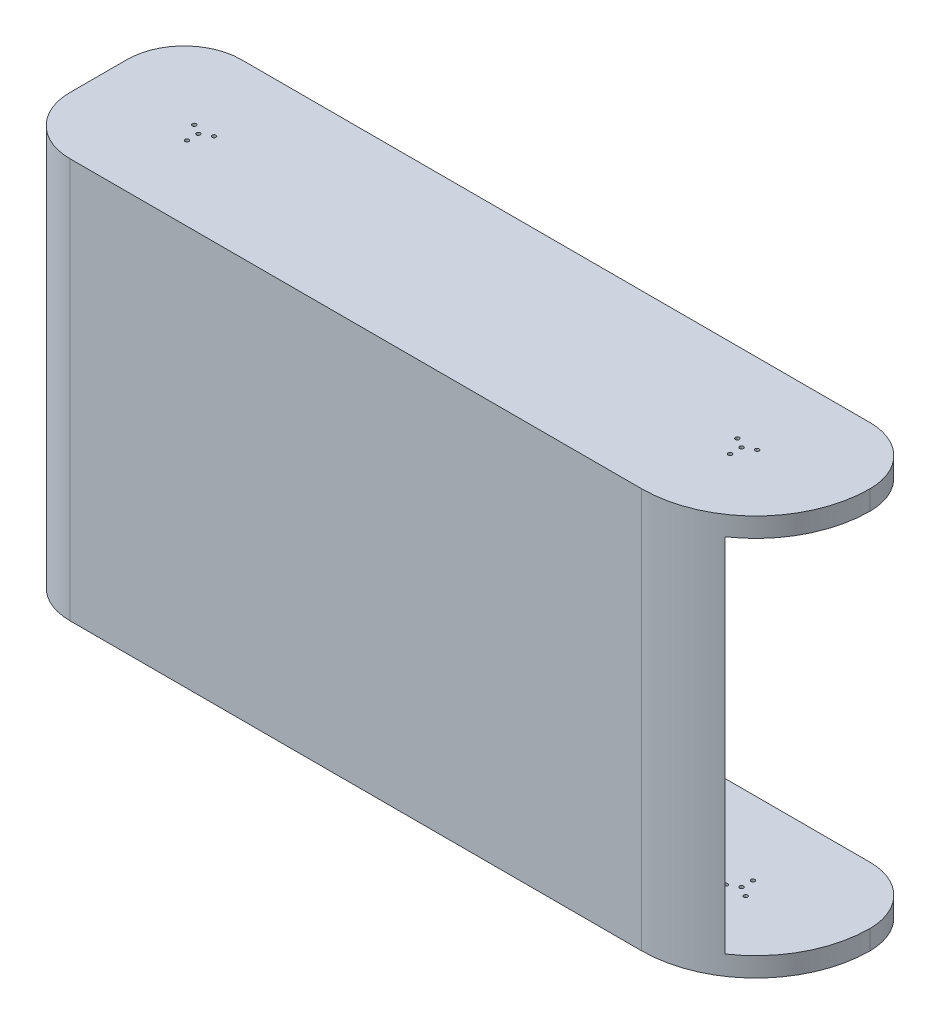
ISO-10303-21;
HEADER;
FILE_DESCRIPTION(('STEP AP214'),'2;1');
FILE_NAME('part.step','',(''),(''),'','','');
FILE_SCHEMA(('AUTOMOTIVE_DESIGN { 1 0 10303 214 1 1 1 1 }'));
ENDSEC;
DATA;
#1=APPLICATION_CONTEXT('core data for automotive mechanical design processes');
#2=APPLICATION_PROTOCOL_DEFINITION('international standard','automotive_design',2000,#1);
#3=PRODUCT_CONTEXT('',#1,'mechanical');
#4=PRODUCT('Part','Part','',(#3));
#5=PRODUCT_RELATED_PRODUCT_CATEGORY('part','',(#4));
#6=PRODUCT_DEFINITION_FORMATION('','',#4);
#7=PRODUCT_DEFINITION_CONTEXT('part definition',#1,'design');
#8=PRODUCT_DEFINITION('design','',#6,#7);
#9=PRODUCT_DEFINITION_SHAPE('','',#8);
#10=(LENGTH_UNIT() NAMED_UNIT(*) SI_UNIT(.MILLI.,.METRE.));
#11=(NAMED_UNIT(*) PLANE_ANGLE_UNIT() SI_UNIT($,.RADIAN.));
#12=(NAMED_UNIT(*) SI_UNIT($,.STERADIAN.) SOLID_ANGLE_UNIT());
#13=UNCERTAINTY_MEASURE_WITH_UNIT(LENGTH_MEASURE(1.E-05),#10,'distance_accuracy_value','');
#14=(GEOMETRIC_REPRESENTATION_CONTEXT(3) GLOBAL_UNCERTAINTY_ASSIGNED_CONTEXT((#13)) GLOBAL_UNIT_ASSIGNED_CONTEXT((#10,
#11,#12)) REPRESENTATION_CONTEXT('',''));
#15=CARTESIAN_POINT('',(0.,0.,0.));
#16=DIRECTION('',(0.,0.,1.));
#17=DIRECTION('',(1.,0.,0.));
#18=AXIS2_PLACEMENT_3D('',#15,#16,#17);
#19=CARTESIAN_POINT('',(760.000000000001,34.0119444174939,115.831345179178));
#20=DIRECTION('',(0.,-1.,0.));
#21=DIRECTION('',(0.,0.,-1.));
#22=AXIS2_PLACEMENT_3D('',#19,#20,#21);
#23=PLANE('',#22);
#24=CARTESIAN_POINT('',(475.,34.0119444174939,0.));
#25=DIRECTION('',(0.,-1.,0.));
#26=DIRECTION('',(0.,0.,-1.));
#27=AXIS2_PLACEMENT_3D('',#24,#25,#26);
#28=CIRCLE('',#27,3.40000000000003);
#29=CARTESIAN_POINT('',(475.,34.0119444174939,-3.40000000000001));
#30=VERTEX_POINT('',#29);
#31=EDGE_CURVE('E256',#30,#30,#28,.F.);
#32=ORIENTED_EDGE('',*,*,#31,.F.);
#33=EDGE_LOOP('',(#32));
#34=FACE_BOUND('',#33,.T.);
#35=CARTESIAN_POINT('',(-492.320508075689,34.0119444174939,9.99999999999999));
#36=DIRECTION('',(0.,-1.,0.));
#37=DIRECTION('',(0.,0.,-1.));
#38=AXIS2_PLACEMENT_3D('',#35,#36,#37);
#39=CIRCLE('',#38,3.40000000000003);
#40=CARTESIAN_POINT('',(-492.320508075689,34.0119444174939,6.59999999999996));
#41=VERTEX_POINT('',#40);
#42=EDGE_CURVE('E250',#41,#41,#39,.F.);
#43=ORIENTED_EDGE('',*,*,#42,.F.);
#44=EDGE_LOOP('',(#43));
#45=FACE_BOUND('',#44,.T.);
#46=CARTESIAN_POINT('',(-475.,34.0119444174939,-1.16341445918999E-13));
#47=DIRECTION('',(0.,-1.,0.));
#48=DIRECTION('',(0.,0.,-1.));
#49=AXIS2_PLACEMENT_3D('',#46,#47,#48);
#50=CIRCLE('',#49,3.40000000000003);
#51=CARTESIAN_POINT('',(-475.,34.0119444174939,-3.40000000000014));
#52=VERTEX_POINT('',#51);
#53=EDGE_CURVE('E244',#52,#52,#50,.F.);
#54=ORIENTED_EDGE('',*,*,#53,.F.);
#55=EDGE_LOOP('',(#54));
#56=FACE_BOUND('',#55,.T.);
#57=CARTESIAN_POINT('',(457.679491924311,34.0119444174939,9.99999999999983));
#58=DIRECTION('',(0.,-1.,0.));
#59=DIRECTION('',(0.,0.,-1.));
#60=AXIS2_PLACEMENT_3D('',#57,#58,#59);
#61=CIRCLE('',#60,3.40000000000003);
#62=CARTESIAN_POINT('',(457.679491924311,34.0119444174939,6.5999999999998));
#63=VERTEX_POINT('',#62);
#64=EDGE_CURVE('E238',#63,#63,#61,.F.);
#65=ORIENTED_EDGE('',*,*,#64,.F.);
#66=EDGE_LOOP('',(#65));
#67=FACE_BOUND('',#66,.T.);
#68=CARTESIAN_POINT('',(492.320508075689,34.0119444174939,10.0000000000001));
#69=DIRECTION('',(0.,-1.,0.));
#70=DIRECTION('',(0.,0.,-1.));
#71=AXIS2_PLACEMENT_3D('',#68,#69,#70);
#72=CIRCLE('',#71,3.40000000000003);
#73=CARTESIAN_POINT('',(492.320508075689,34.0119444174939,6.60000000000008));
#74=VERTEX_POINT('',#73);
#75=EDGE_CURVE('E237',#74,#74,#72,.F.);
#76=ORIENTED_EDGE('',*,*,#75,.F.);
#77=EDGE_LOOP('',(#76));
#78=FACE_BOUND('',#77,.T.);
#79=CARTESIAN_POINT('',(475.,34.0119444174939,-20.));
#80=DIRECTION('',(0.,-1.,0.));
#81=DIRECTION('',(0.,0.,-1.));
#82=AXIS2_PLACEMENT_3D('',#79,#80,#81);
#83=CIRCLE('',#82,3.40000000000003);
#84=CARTESIAN_POINT('',(475.,34.0119444174939,-23.4));
#85=VERTEX_POINT('',#84);
#86=EDGE_CURVE('E241',#85,#85,#83,.F.);
#87=ORIENTED_EDGE('',*,*,#86,.F.);
#88=EDGE_LOOP('',(#87));
#89=FACE_BOUND('',#88,.T.);
#90=CARTESIAN_POINT('',(-457.679491924311,34.0119444174939,9.99999999999973));
#91=DIRECTION('',(0.,-1.,0.));
#92=DIRECTION('',(0.,0.,-1.));
#93=AXIS2_PLACEMENT_3D('',#90,#91,#92);
#94=CIRCLE('',#93,3.40000000000003);
#95=CARTESIAN_POINT('',(-457.679491924311,34.0119444174939,6.5999999999997));
#96=VERTEX_POINT('',#95);
#97=EDGE_CURVE('E247',#96,#96,#94,.F.);
#98=ORIENTED_EDGE('',*,*,#97,.F.);
#99=EDGE_LOOP('',(#98));
#100=FACE_BOUND('',#99,.T.);
#101=CARTESIAN_POINT('',(-475.,34.0119444174939,-20.0000000000001));
#102=DIRECTION('',(0.,-1.,0.));
#103=DIRECTION('',(0.,0.,-1.));
#104=AXIS2_PLACEMENT_3D('',#101,#102,#103);
#105=CIRCLE('',#104,3.40000000000003);
#106=CARTESIAN_POINT('',(-475.,34.0119444174939,-23.4000000000001));
#107=VERTEX_POINT('',#106);
#108=EDGE_CURVE('E253',#107,#107,#105,.F.);
#109=ORIENTED_EDGE('',*,*,#108,.F.);
#110=EDGE_LOOP('',(#109));
#111=FACE_BOUND('',#110,.T.);
#112=DIRECTION('',(0.,0.,-1.));
#113=VECTOR('',#112,1.);
#114=CARTESIAN_POINT('',(149.543106064845,34.0119444174939,-150.));
#115=LINE('',#114,#113);
#116=CARTESIAN_POINT('',(149.543106064845,34.0119444174939,-114.978897587595));
#117=VERTEX_POINT('',#116);
#118=CARTESIAN_POINT('',(149.543106064845,34.0119444174939,-150.));
#119=VERTEX_POINT('',#118);
#120=EDGE_CURVE('E192',#117,#119,#115,.T.);
#121=ORIENTED_EDGE('',*,*,#120,.F.);
#122=DIRECTION('',(1.,0.,0.));
#123=VECTOR('',#122,1.);
#124=CARTESIAN_POINT('',(149.543106064845,34.0119444174939,-114.978897587595));
#125=LINE('',#124,#123);
#126=CARTESIAN_POINT('',(-203.152898805073,34.0119444174939,-114.978897587595));
#127=VERTEX_POINT('',#126);
#128=EDGE_CURVE('E54',#127,#117,#125,.T.);
#129=ORIENTED_EDGE('',*,*,#128,.F.);
#130=DIRECTION('',(0.,0.,1.));
#131=VECTOR('',#130,1.);
#132=CARTESIAN_POINT('',(-203.152898805073,34.0119444174939,-150.));
#133=LINE('',#132,#131);
#134=CARTESIAN_POINT('',(-203.152898805073,34.0119444174939,-150.));
#135=VERTEX_POINT('',#134);
#136=EDGE_CURVE('E178',#135,#127,#133,.T.);
#137=ORIENTED_EDGE('',*,*,#136,.F.);
#138=DIRECTION('',(1.,0.,0.));
#139=VECTOR('',#138,1.);
#140=CARTESIAN_POINT('',(-650.,34.0119444174939,-150.));
#141=LINE('',#140,#139);
#142=CARTESIAN_POINT('',(-550.,34.0119444174939,-150.));
#143=VERTEX_POINT('',#142);
#144=EDGE_CURVE('E261',#143,#135,#141,.T.);
#145=ORIENTED_EDGE('',*,*,#144,.F.);
#146=CARTESIAN_POINT('',(-550.,34.0119444174939,-50.));
#147=DIRECTION('',(0.,-1.,0.));
#148=DIRECTION('',(0.,0.,-1.));
#149=AXIS2_PLACEMENT_3D('',#146,#147,#148);
#150=CIRCLE('',#149,100.);
#151=CARTESIAN_POINT('',(-650.,34.0119444174939,-50.));
#152=VERTEX_POINT('',#151);
#153=EDGE_CURVE('E259',#143,#152,#150,.F.);
#154=ORIENTED_EDGE('',*,*,#153,.T.);
#155=DIRECTION('',(0.,0.,1.));
#156=VECTOR('',#155,1.);
#157=CARTESIAN_POINT('',(-650.,34.0119444174939,115.831345179178));
#158=LINE('',#157,#156);
#159=CARTESIAN_POINT('',(-650.,34.0119444174939,50.));
#160=VERTEX_POINT('',#159);
#161=EDGE_CURVE('E196',#152,#160,#158,.T.);
#162=ORIENTED_EDGE('',*,*,#161,.T.);
#163=CARTESIAN_POINT('',(-550.,34.0119444174939,50.));
#164=DIRECTION('',(0.,-1.,0.));
#165=DIRECTION('',(0.,0.,-1.));
#166=AXIS2_PLACEMENT_3D('',#163,#164,#165);
#167=CIRCLE('',#166,100.);
#168=CARTESIAN_POINT('',(-625.274391341943,34.0119444174939,115.831345179178));
#169=VERTEX_POINT('',#168);
#170=EDGE_CURVE('E268',#160,#169,#167,.F.);
#171=ORIENTED_EDGE('',*,*,#170,.T.);
#172=DIRECTION('',(-1.,0.,0.));
#173=VECTOR('',#172,1.);
#174=CARTESIAN_POINT('',(760.000000000001,34.0119444174939,115.831345179178));
#175=LINE('',#174,#173);
#176=CARTESIAN_POINT('',(561.803242153635,34.0119444174939,115.831345179178));
#177=VERTEX_POINT('',#176);
#178=EDGE_CURVE('E198',#177,#169,#175,.T.);
#179=ORIENTED_EDGE('',*,*,#178,.F.);
#180=CARTESIAN_POINT('',(450.,34.0119444174939,-50.0000000000001));
#181=DIRECTION('',(0.,-1.,0.));
#182=DIRECTION('',(0.,0.,-1.));
#183=AXIS2_PLACEMENT_3D('',#180,#181,#182);
#184=CIRCLE('',#183,200.);
#185=CARTESIAN_POINT('',(650.,34.0119444174939,-50.0000000000001));
#186=VERTEX_POINT('',#185);
#187=EDGE_CURVE('E266',#177,#186,#184,.F.);
#188=ORIENTED_EDGE('',*,*,#187,.T.);
#189=CARTESIAN_POINT('',(550.,34.0119444174939,-50.0000000000001));
#190=DIRECTION('',(0.,-1.,0.));
#191=DIRECTION('',(0.,0.,-1.));
#192=AXIS2_PLACEMENT_3D('',#189,#190,#191);
#193=CIRCLE('',#192,100.);
#194=CARTESIAN_POINT('',(550.,34.0119444174939,-150.));
#195=VERTEX_POINT('',#194);
#196=EDGE_CURVE('E264',#186,#195,#193,.F.);
#197=ORIENTED_EDGE('',*,*,#196,.T.);
#198=EDGE_CURVE('E60',#119,#195,#141,.T.);
#199=ORIENTED_EDGE('',*,*,#198,.F.);
#200=EDGE_LOOP('',(#121,#129,#137,#145,#154,#162,#171,#179,#188,#197,#199));
#201=FACE_BOUND('',#200,.T.);
#202=ADVANCED_FACE('F39',(#34,#45,#56,#67,#78,#89,#100,#111,#201),#23,.F.);
#203=CARTESIAN_POINT('',(760.000000000001,665.988055582506,115.831345179178));
#204=DIRECTION('',(0.,1.,0.));
#205=DIRECTION('',(0.,0.,1.));
#206=AXIS2_PLACEMENT_3D('',#203,#204,#205);
#207=PLANE('',#206);
#208=CARTESIAN_POINT('',(-475.,665.988055582506,-1.16341445918999E-13));
#209=DIRECTION('',(0.,1.,0.));
#210=DIRECTION('',(0.,0.,1.));
#211=AXIS2_PLACEMENT_3D('',#208,#209,#210);
#212=CIRCLE('',#211,3.40000000000003);
#213=CARTESIAN_POINT('',(-475.,665.988055582506,3.39999999999991));
#214=VERTEX_POINT('',#213);
#215=EDGE_CURVE('E223',#214,#214,#212,.F.);
#216=ORIENTED_EDGE('',*,*,#215,.F.);
#217=EDGE_LOOP('',(#216));
#218=FACE_BOUND('',#217,.T.);
#219=CARTESIAN_POINT('',(-457.679491924311,665.988055582506,-10.0000000000002));
#220=DIRECTION('',(0.,1.,0.));
#221=DIRECTION('',(0.,0.,1.));
#222=AXIS2_PLACEMENT_3D('',#219,#220,#221);
#223=CIRCLE('',#222,3.40000000000003);
#224=CARTESIAN_POINT('',(-457.679491924311,665.988055582506,-6.6000000000002));
#225=VERTEX_POINT('',#224);
#226=EDGE_CURVE('E217',#225,#225,#223,.F.);
#227=ORIENTED_EDGE('',*,*,#226,.F.);
#228=EDGE_LOOP('',(#227));
#229=FACE_BOUND('',#228,.T.);
#230=CARTESIAN_POINT('',(-475.,665.988055582506,19.9999999999999));
#231=DIRECTION('',(0.,1.,0.));
#232=DIRECTION('',(0.,0.,1.));
#233=AXIS2_PLACEMENT_3D('',#230,#231,#232);
#234=CIRCLE('',#233,3.40000000000003);
#235=CARTESIAN_POINT('',(-475.,665.988055582506,23.3999999999999));
#236=VERTEX_POINT('',#235);
#237=EDGE_CURVE('E211',#236,#236,#234,.F.);
#238=ORIENTED_EDGE('',*,*,#237,.F.);
#239=EDGE_LOOP('',(#238));
#240=FACE_BOUND('',#239,.T.);
#241=CARTESIAN_POINT('',(492.320508075689,665.988055582506,-10.0000000000001));
#242=DIRECTION('',(0.,1.,0.));
#243=DIRECTION('',(0.,0.,1.));
#244=AXIS2_PLACEMENT_3D('',#241,#242,#243);
#245=CIRCLE('',#244,3.40000000000003);
#246=CARTESIAN_POINT('',(492.320508075689,665.988055582506,-6.60000000000007));
#247=VERTEX_POINT('',#246);
#248=EDGE_CURVE('E205',#247,#247,#245,.F.);
#249=ORIENTED_EDGE('',*,*,#248,.F.);
#250=EDGE_LOOP('',(#249));
#251=FACE_BOUND('',#250,.T.);
#252=CARTESIAN_POINT('',(475.,665.988055582506,20.));
#253=DIRECTION('',(0.,1.,0.));
#254=DIRECTION('',(0.,0.,1.));
#255=AXIS2_PLACEMENT_3D('',#252,#253,#254);
#256=CIRCLE('',#255,3.40000000000003);
#257=CARTESIAN_POINT('',(475.,665.988055582506,23.4));
#258=VERTEX_POINT('',#257);
#259=EDGE_CURVE('E202',#258,#258,#256,.F.);
#260=ORIENTED_EDGE('',*,*,#259,.F.);
#261=EDGE_LOOP('',(#260));
#262=FACE_BOUND('',#261,.T.);
#263=CARTESIAN_POINT('',(475.,665.988055582506,0.));
#264=DIRECTION('',(0.,1.,0.));
#265=DIRECTION('',(0.,0.,1.));
#266=AXIS2_PLACEMENT_3D('',#263,#264,#265);
#267=CIRCLE('',#266,3.40000000000003);
#268=CARTESIAN_POINT('',(475.,665.988055582506,3.40000000000004));
#269=VERTEX_POINT('',#268);
#270=EDGE_CURVE('E208',#269,#269,#267,.F.);
#271=ORIENTED_EDGE('',*,*,#270,.F.);
#272=EDGE_LOOP('',(#271));
#273=FACE_BOUND('',#272,.T.);
#274=CARTESIAN_POINT('',(457.679491924311,665.988055582506,-9.99999999999982));
#275=DIRECTION('',(0.,1.,0.));
#276=DIRECTION('',(0.,0.,1.));
#277=AXIS2_PLACEMENT_3D('',#274,#275,#276);
#278=CIRCLE('',#277,3.40000000000003);
#279=CARTESIAN_POINT('',(457.679491924311,665.988055582506,-6.59999999999979));
#280=VERTEX_POINT('',#279);
#281=EDGE_CURVE('E214',#280,#280,#278,.F.);
#282=ORIENTED_EDGE('',*,*,#281,.F.);
#283=EDGE_LOOP('',(#282));
#284=FACE_BOUND('',#283,.T.);
#285=CARTESIAN_POINT('',(-492.320508075689,665.988055582506,-9.99999999999994));
#286=DIRECTION('',(0.,1.,0.));
#287=DIRECTION('',(0.,0.,1.));
#288=AXIS2_PLACEMENT_3D('',#285,#286,#287);
#289=CIRCLE('',#288,3.40000000000003);
#290=CARTESIAN_POINT('',(-492.320508075689,665.988055582506,-6.59999999999992));
#291=VERTEX_POINT('',#290);
#292=EDGE_CURVE('E220',#291,#291,#289,.F.);
#293=ORIENTED_EDGE('',*,*,#292,.F.);
#294=EDGE_LOOP('',(#293));
#295=FACE_BOUND('',#294,.T.);
#296=DIRECTION('',(0.,0.,-1.));
#297=VECTOR('',#296,1.);
#298=CARTESIAN_POINT('',(149.543106064845,665.988055582506,-150.));
#299=LINE('',#298,#297);
#300=CARTESIAN_POINT('',(149.543106064845,665.988055582506,-114.978897587595));
#301=VERTEX_POINT('',#300);
#302=CARTESIAN_POINT('',(149.543106064845,665.988055582506,-150.));
#303=VERTEX_POINT('',#302);
#304=EDGE_CURVE('E173',#301,#303,#299,.T.);
#305=ORIENTED_EDGE('',*,*,#304,.T.);
#306=DIRECTION('',(-1.,0.,0.));
#307=VECTOR('',#306,1.);
#308=CARTESIAN_POINT('',(-650.,665.988055582506,-150.));
#309=LINE('',#308,#307);
#310=CARTESIAN_POINT('',(550.,665.988055582506,-150.));
#311=VERTEX_POINT('',#310);
#312=EDGE_CURVE('E228',#311,#303,#309,.T.);
#313=ORIENTED_EDGE('',*,*,#312,.F.);
#314=CARTESIAN_POINT('',(550.,665.988055582506,-50.0000000000001));
#315=DIRECTION('',(0.,1.,0.));
#316=DIRECTION('',(0.,0.,1.));
#317=AXIS2_PLACEMENT_3D('',#314,#315,#316);
#318=CIRCLE('',#317,100.);
#319=CARTESIAN_POINT('',(650.,665.988055582506,-50.0000000000001));
#320=VERTEX_POINT('',#319);
#321=EDGE_CURVE('E231',#311,#320,#318,.F.);
#322=ORIENTED_EDGE('',*,*,#321,.T.);
#323=CARTESIAN_POINT('',(450.,665.988055582506,-50.0000000000001));
#324=DIRECTION('',(0.,1.,0.));
#325=DIRECTION('',(0.,0.,1.));
#326=AXIS2_PLACEMENT_3D('',#323,#324,#325);
#327=CIRCLE('',#326,200.);
#328=CARTESIAN_POINT('',(561.803242153635,665.988055582506,115.831345179178));
#329=VERTEX_POINT('',#328);
#330=EDGE_CURVE('E233',#320,#329,#327,.F.);
#331=ORIENTED_EDGE('',*,*,#330,.T.);
#332=DIRECTION('',(-1.,0.,0.));
#333=VECTOR('',#332,1.);
#334=CARTESIAN_POINT('',(760.000000000001,665.988055582506,115.831345179178));
#335=LINE('',#334,#333);
#336=CARTESIAN_POINT('',(-625.274391341943,665.988055582506,115.831345179178));
#337=VERTEX_POINT('',#336);
#338=EDGE_CURVE('E199',#329,#337,#335,.T.);
#339=ORIENTED_EDGE('',*,*,#338,.T.);
#340=CARTESIAN_POINT('',(-550.,665.988055582506,50.));
#341=DIRECTION('',(0.,1.,0.));
#342=DIRECTION('',(0.,0.,1.));
#343=AXIS2_PLACEMENT_3D('',#340,#341,#342);
#344=CIRCLE('',#343,100.);
#345=CARTESIAN_POINT('',(-650.,665.988055582506,50.));
#346=VERTEX_POINT('',#345);
#347=EDGE_CURVE('E235',#337,#346,#344,.F.);
#348=ORIENTED_EDGE('',*,*,#347,.T.);
#349=DIRECTION('',(0.,0.,-1.));
#350=VECTOR('',#349,1.);
#351=CARTESIAN_POINT('',(-650.,665.988055582506,115.831345179178));
#352=LINE('',#351,#350);
#353=CARTESIAN_POINT('',(-650.,665.988055582506,-50.));
#354=VERTEX_POINT('',#353);
#355=EDGE_CURVE('E172',#346,#354,#352,.T.);
#356=ORIENTED_EDGE('',*,*,#355,.T.);
#357=CARTESIAN_POINT('',(-550.,665.988055582506,-50.));
#358=DIRECTION('',(0.,1.,0.));
#359=DIRECTION('',(0.,0.,1.));
#360=AXIS2_PLACEMENT_3D('',#357,#358,#359);
#361=CIRCLE('',#360,100.);
#362=CARTESIAN_POINT('',(-550.,665.988055582506,-150.));
#363=VERTEX_POINT('',#362);
#364=EDGE_CURVE('E226',#354,#363,#361,.F.);
#365=ORIENTED_EDGE('',*,*,#364,.T.);
#366=CARTESIAN_POINT('',(-203.152898805073,665.988055582506,-150.));
#367=VERTEX_POINT('',#366);
#368=EDGE_CURVE('E168',#367,#363,#309,.T.);
#369=ORIENTED_EDGE('',*,*,#368,.F.);
#370=DIRECTION('',(0.,0.,1.));
#371=VECTOR('',#370,1.);
#372=CARTESIAN_POINT('',(-203.152898805073,665.988055582506,-150.));
#373=LINE('',#372,#371);
#374=CARTESIAN_POINT('',(-203.152898805073,665.988055582506,-114.978897587595));
#375=VERTEX_POINT('',#374);
#376=EDGE_CURVE('E161',#367,#375,#373,.T.);
#377=ORIENTED_EDGE('',*,*,#376,.T.);
#378=DIRECTION('',(1.,0.,0.));
#379=VECTOR('',#378,1.);
#380=CARTESIAN_POINT('',(149.543106064845,665.988055582506,-114.978897587595));
#381=LINE('',#380,#379);
#382=EDGE_CURVE('E165',#375,#301,#381,.T.);
#383=ORIENTED_EDGE('',*,*,#382,.T.);
#384=EDGE_LOOP('',(#305,#313,#322,#331,#339,#348,#356,#365,#369,#377,#383));
#385=FACE_BOUND('',#384,.T.);
#386=ADVANCED_FACE('F163',(#218,#229,#240,#251,#262,#273,#284,#295,#385),#207,.F.);
#387=CARTESIAN_POINT('',(-650.,700.,-150.));
#388=DIRECTION('',(1.,0.,0.));
#389=DIRECTION('',(0.,0.,-1.));
#390=AXIS2_PLACEMENT_3D('',#387,#388,#389);
#391=PLANE('',#390);
#392=DIRECTION('',(0.,-1.,0.));
#393=VECTOR('',#392,1.);
#394=CARTESIAN_POINT('',(-650.,700.,-50.));
#395=LINE('',#394,#393);
#396=CARTESIAN_POINT('',(-650.,700.,-50.));
#397=VERTEX_POINT('',#396);
#398=EDGE_CURVE('E369',#397,#354,#395,.T.);
#399=ORIENTED_EDGE('',*,*,#398,.T.);
#400=ORIENTED_EDGE('',*,*,#355,.F.);
#401=DIRECTION('',(0.,-1.,0.));
#402=VECTOR('',#401,1.);
#403=CARTESIAN_POINT('',(-650.,700.,50.));
#404=LINE('',#403,#402);
#405=CARTESIAN_POINT('',(-650.,700.,50.));
#406=VERTEX_POINT('',#405);
#407=EDGE_CURVE('E362',#346,#406,#404,.F.);
#408=ORIENTED_EDGE('',*,*,#407,.T.);
#409=DIRECTION('',(0.,0.,1.));
#410=VECTOR('',#409,1.);
#411=CARTESIAN_POINT('',(-650.,700.,-150.));
#412=LINE('',#411,#410);
#413=EDGE_CURVE('E324',#397,#406,#412,.T.);
#414=ORIENTED_EDGE('',*,*,#413,.F.);
#415=EDGE_LOOP('',(#399,#400,#408,#414));
#416=FACE_BOUND('',#415,.T.);
#417=ADVANCED_FACE('F448',(#416),#391,.F.);
#418=CARTESIAN_POINT('',(550.,700.,-50.0000000000001));
#419=DIRECTION('',(0.,-1.,0.));
#420=DIRECTION('',(0.,0.,-1.));
#421=AXIS2_PLACEMENT_3D('',#418,#419,#420);
#422=CYLINDRICAL_SURFACE('',#421,100.);
#423=ORIENTED_EDGE('',*,*,#321,.F.);
#424=DIRECTION('',(0.,-1.,0.));
#425=VECTOR('',#424,1.);
#426=CARTESIAN_POINT('',(550.,700.,-150.));
#427=LINE('',#426,#425);
#428=CARTESIAN_POINT('',(550.,700.,-150.));
#429=VERTEX_POINT('',#428);
#430=EDGE_CURVE('E348',#429,#311,#427,.T.);
#431=ORIENTED_EDGE('',*,*,#430,.F.);
#432=CARTESIAN_POINT('',(550.,700.,-50.0000000000001));
#433=DIRECTION('',(0.,1.,0.));
#434=DIRECTION('',(0.,0.,1.));
#435=AXIS2_PLACEMENT_3D('',#432,#433,#434);
#436=CIRCLE('',#435,100.);
#437=CARTESIAN_POINT('',(650.,700.,-50.0000000000001));
#438=VERTEX_POINT('',#437);
#439=EDGE_CURVE('E354',#438,#429,#436,.T.);
#440=ORIENTED_EDGE('',*,*,#439,.F.);
#441=DIRECTION('',(0.,-1.,0.));
#442=VECTOR('',#441,1.);
#443=CARTESIAN_POINT('',(650.,700.,-50.0000000000001));
#444=LINE('',#443,#442);
#445=EDGE_CURVE('E336',#438,#320,#444,.T.);
#446=ORIENTED_EDGE('',*,*,#445,.T.);
#447=EDGE_LOOP('',(#423,#431,#440,#446));
#448=FACE_BOUND('',#447,.T.);
#449=ADVANCED_FACE('F407',(#448),#422,.T.);
#450=CARTESIAN_POINT('',(-550.,700.,-50.));
#451=DIRECTION('',(0.,-1.,0.));
#452=DIRECTION('',(0.,0.,-1.));
#453=AXIS2_PLACEMENT_3D('',#450,#451,#452);
#454=CYLINDRICAL_SURFACE('',#453,100.);
#455=ORIENTED_EDGE('',*,*,#364,.F.);
#456=ORIENTED_EDGE('',*,*,#398,.F.);
#457=CARTESIAN_POINT('',(-550.,700.,-50.));
#458=DIRECTION('',(0.,1.,0.));
#459=DIRECTION('',(0.,0.,1.));
#460=AXIS2_PLACEMENT_3D('',#457,#458,#459);
#461=CIRCLE('',#460,100.);
#462=CARTESIAN_POINT('',(-550.,700.,-150.));
#463=VERTEX_POINT('',#462);
#464=EDGE_CURVE('E47',#463,#397,#461,.T.);
#465=ORIENTED_EDGE('',*,*,#464,.F.);
#466=DIRECTION('',(0.,-1.,0.));
#467=VECTOR('',#466,1.);
#468=CARTESIAN_POINT('',(-550.,700.,-150.));
#469=LINE('',#468,#467);
#470=EDGE_CURVE('E374',#363,#463,#469,.F.);
#471=ORIENTED_EDGE('',*,*,#470,.F.);
#472=EDGE_LOOP('',(#455,#456,#465,#471));
#473=FACE_BOUND('',#472,.T.);
#474=ADVANCED_FACE('F453',(#473),#454,.T.);
#475=CARTESIAN_POINT('',(-650.,700.,-150.));
#476=DIRECTION('',(0.,0.,1.));
#477=DIRECTION('',(1.,0.,0.));
#478=AXIS2_PLACEMENT_3D('',#475,#476,#477);
#479=PLANE('',#478);
#480=CARTESIAN_POINT('',(-550.,0.,-150.));
#481=VERTEX_POINT('',#480);
#482=EDGE_CURVE('E375',#481,#143,#469,.F.);
#483=ORIENTED_EDGE('',*,*,#482,.T.);
#484=ORIENTED_EDGE('',*,*,#144,.T.);
#485=DIRECTION('',(0.,-1.,0.));
#486=VECTOR('',#485,1.);
#487=CARTESIAN_POINT('',(-203.152898805073,1020.41851345172,-150.));
#488=LINE('',#487,#486);
#489=EDGE_CURVE('E191',#367,#135,#488,.T.);
#490=ORIENTED_EDGE('',*,*,#489,.F.);
#491=ORIENTED_EDGE('',*,*,#368,.T.);
#492=ORIENTED_EDGE('',*,*,#470,.T.);
#493=DIRECTION('',(-1.,0.,0.));
#494=VECTOR('',#493,1.);
#495=CARTESIAN_POINT('',(-650.,700.,-150.));
#496=LINE('',#495,#494);
#497=EDGE_CURVE('E321',#429,#463,#496,.T.);
#498=ORIENTED_EDGE('',*,*,#497,.F.);
#499=ORIENTED_EDGE('',*,*,#430,.T.);
#500=ORIENTED_EDGE('',*,*,#312,.T.);
#501=DIRECTION('',(0.,-1.,0.));
#502=VECTOR('',#501,1.);
#503=CARTESIAN_POINT('',(149.543106064845,1020.41851345172,-150.));
#504=LINE('',#503,#502);
#505=EDGE_CURVE('E189',#303,#119,#504,.T.);
#506=ORIENTED_EDGE('',*,*,#505,.T.);
#507=ORIENTED_EDGE('',*,*,#198,.T.);
#508=CARTESIAN_POINT('',(550.,0.,-150.));
#509=VERTEX_POINT('',#508);
#510=EDGE_CURVE('E347',#195,#509,#427,.T.);
#511=ORIENTED_EDGE('',*,*,#510,.T.);
#512=DIRECTION('',(-1.,0.,0.));
#513=VECTOR('',#512,1.);
#514=CARTESIAN_POINT('',(-650.,0.,-150.));
#515=LINE('',#514,#513);
#516=EDGE_CURVE('E320',#509,#481,#515,.T.);
#517=ORIENTED_EDGE('',*,*,#516,.T.);
#518=EDGE_LOOP('',(#483,#484,#490,#491,#492,#498,#499,#500,#506,#507,#511,#517));
#519=FACE_BOUND('',#518,.T.);
#520=ADVANCED_FACE('F402',(#519),#479,.F.);
#521=CARTESIAN_POINT('',(-650.,0.,50.));
#522=VERTEX_POINT('',#521);
#523=EDGE_CURVE('E363',#522,#160,#404,.F.);
#524=ORIENTED_EDGE('',*,*,#523,.T.);
#525=ORIENTED_EDGE('',*,*,#161,.F.);
#526=CARTESIAN_POINT('',(-650.,0.,-50.));
#527=VERTEX_POINT('',#526);
#528=EDGE_CURVE('E368',#152,#527,#395,.T.);
#529=ORIENTED_EDGE('',*,*,#528,.T.);
#530=DIRECTION('',(0.,0.,1.));
#531=VECTOR('',#530,1.);
#532=CARTESIAN_POINT('',(-650.,0.,-150.));
#533=LINE('',#532,#531);
#534=EDGE_CURVE('E333',#527,#522,#533,.T.);
#535=ORIENTED_EDGE('',*,*,#534,.T.);
#536=EDGE_LOOP('',(#524,#525,#529,#535));
#537=FACE_BOUND('',#536,.T.);
#538=ADVANCED_FACE('F429',(#537),#391,.F.);
#539=CARTESIAN_POINT('',(-650.,700.,150.));
#540=DIRECTION('',(0.,0.,-1.));
#541=DIRECTION('',(-1.,0.,0.));
#542=AXIS2_PLACEMENT_3D('',#539,#540,#541);
#543=PLANE('',#542);
#544=DIRECTION('',(1.,0.,0.));
#545=VECTOR('',#544,1.);
#546=CARTESIAN_POINT('',(-650.,700.,150.));
#547=LINE('',#546,#545);
#548=CARTESIAN_POINT('',(-550.,700.,150.));
#549=VERTEX_POINT('',#548);
#550=CARTESIAN_POINT('',(450.,700.,150.));
#551=VERTEX_POINT('',#550);
#552=EDGE_CURVE('E328',#549,#551,#547,.T.);
#553=ORIENTED_EDGE('',*,*,#552,.F.);
#554=DIRECTION('',(0.,-1.,0.));
#555=VECTOR('',#554,1.);
#556=CARTESIAN_POINT('',(-550.,700.,150.));
#557=LINE('',#556,#555);
#558=CARTESIAN_POINT('',(-550.,0.,150.));
#559=VERTEX_POINT('',#558);
#560=EDGE_CURVE('E356',#549,#559,#557,.T.);
#561=ORIENTED_EDGE('',*,*,#560,.T.);
#562=DIRECTION('',(1.,0.,0.));
#563=VECTOR('',#562,1.);
#564=CARTESIAN_POINT('',(-650.,0.,150.));
#565=LINE('',#564,#563);
#566=CARTESIAN_POINT('',(450.,0.,150.));
#567=VERTEX_POINT('',#566);
#568=EDGE_CURVE('E325',#559,#567,#565,.T.);
#569=ORIENTED_EDGE('',*,*,#568,.T.);
#570=DIRECTION('',(0.,-1.,0.));
#571=VECTOR('',#570,1.);
#572=CARTESIAN_POINT('',(450.,700.,150.));
#573=LINE('',#572,#571);
#574=EDGE_CURVE('E342',#567,#551,#573,.F.);
#575=ORIENTED_EDGE('',*,*,#574,.T.);
#576=EDGE_LOOP('',(#553,#561,#569,#575));
#577=FACE_BOUND('',#576,.T.);
#578=ADVANCED_FACE('F440',(#577),#543,.F.);
#579=CARTESIAN_POINT('',(0.,700.,0.));
#580=DIRECTION('',(0.,1.,0.));
#581=DIRECTION('',(0.,0.,1.));
#582=AXIS2_PLACEMENT_3D('',#579,#580,#581);
#583=PLANE('',#582);
#584=CARTESIAN_POINT('',(475.,700.,20.));
#585=DIRECTION('',(0.,1.,0.));
#586=DIRECTION('',(0.,0.,1.));
#587=AXIS2_PLACEMENT_3D('',#584,#585,#586);
#588=CIRCLE('',#587,3.40000000000003);
#589=CARTESIAN_POINT('',(475.,700.,23.4));
#590=VERTEX_POINT('',#589);
#591=EDGE_CURVE('E276',#590,#590,#588,.T.);
#592=ORIENTED_EDGE('',*,*,#591,.F.);
#593=EDGE_LOOP('',(#592));
#594=FACE_BOUND('',#593,.T.);
#595=CARTESIAN_POINT('',(492.320508075689,700.,-10.0000000000001));
#596=DIRECTION('',(0.,1.,0.));
#597=DIRECTION('',(0.,0.,1.));
#598=AXIS2_PLACEMENT_3D('',#595,#596,#597);
#599=CIRCLE('',#598,3.40000000000003);
#600=CARTESIAN_POINT('',(492.320508075689,700.,-6.60000000000007));
#601=VERTEX_POINT('',#600);
#602=EDGE_CURVE('E282',#601,#601,#599,.T.);
#603=ORIENTED_EDGE('',*,*,#602,.F.);
#604=EDGE_LOOP('',(#603));
#605=FACE_BOUND('',#604,.T.);
#606=CARTESIAN_POINT('',(475.,700.,0.));
#607=DIRECTION('',(0.,1.,0.));
#608=DIRECTION('',(0.,0.,1.));
#609=AXIS2_PLACEMENT_3D('',#606,#607,#608);
#610=CIRCLE('',#609,3.40000000000003);
#611=CARTESIAN_POINT('',(475.,700.,3.40000000000004));
#612=VERTEX_POINT('',#611);
#613=EDGE_CURVE('E285',#612,#612,#610,.T.);
#614=ORIENTED_EDGE('',*,*,#613,.F.);
#615=EDGE_LOOP('',(#614));
#616=FACE_BOUND('',#615,.T.);
#617=CARTESIAN_POINT('',(-475.,700.,19.9999999999999));
#618=DIRECTION('',(0.,1.,0.));
#619=DIRECTION('',(0.,0.,1.));
#620=AXIS2_PLACEMENT_3D('',#617,#618,#619);
#621=CIRCLE('',#620,3.40000000000003);
#622=CARTESIAN_POINT('',(-475.,700.,23.3999999999999));
#623=VERTEX_POINT('',#622);
#624=EDGE_CURVE('E288',#623,#623,#621,.T.);
#625=ORIENTED_EDGE('',*,*,#624,.F.);
#626=EDGE_LOOP('',(#625));
#627=FACE_BOUND('',#626,.T.);
#628=CARTESIAN_POINT('',(457.679491924311,700.,-9.99999999999982));
#629=DIRECTION('',(0.,1.,0.));
#630=DIRECTION('',(0.,0.,1.));
#631=AXIS2_PLACEMENT_3D('',#628,#629,#630);
#632=CIRCLE('',#631,3.40000000000003);
#633=CARTESIAN_POINT('',(457.679491924311,700.,-6.59999999999979));
#634=VERTEX_POINT('',#633);
#635=EDGE_CURVE('E273',#634,#634,#632,.T.);
#636=ORIENTED_EDGE('',*,*,#635,.F.);
#637=EDGE_LOOP('',(#636));
#638=FACE_BOUND('',#637,.T.);
#639=CARTESIAN_POINT('',(-457.679491924311,700.,-10.0000000000002));
#640=DIRECTION('',(0.,1.,0.));
#641=DIRECTION('',(0.,0.,1.));
#642=AXIS2_PLACEMENT_3D('',#639,#640,#641);
#643=CIRCLE('',#642,3.40000000000003);
#644=CARTESIAN_POINT('',(-457.679491924311,700.,-6.6000000000002));
#645=VERTEX_POINT('',#644);
#646=EDGE_CURVE('E277',#645,#645,#643,.T.);
#647=ORIENTED_EDGE('',*,*,#646,.F.);
#648=EDGE_LOOP('',(#647));
#649=FACE_BOUND('',#648,.T.);
#650=CARTESIAN_POINT('',(-492.320508075689,700.,-9.99999999999994));
#651=DIRECTION('',(0.,1.,0.));
#652=DIRECTION('',(0.,0.,1.));
#653=AXIS2_PLACEMENT_3D('',#650,#651,#652);
#654=CIRCLE('',#653,3.40000000000003);
#655=CARTESIAN_POINT('',(-492.320508075689,700.,-6.59999999999992));
#656=VERTEX_POINT('',#655);
#657=EDGE_CURVE('E272',#656,#656,#654,.T.);
#658=ORIENTED_EDGE('',*,*,#657,.F.);
#659=EDGE_LOOP('',(#658));
#660=FACE_BOUND('',#659,.T.);
#661=CARTESIAN_POINT('',(-475.,700.,-1.16341445918999E-13));
#662=DIRECTION('',(0.,1.,0.));
#663=DIRECTION('',(0.,0.,1.));
#664=AXIS2_PLACEMENT_3D('',#661,#662,#663);
#665=CIRCLE('',#664,3.40000000000003);
#666=CARTESIAN_POINT('',(-475.,700.,3.39999999999991));
#667=VERTEX_POINT('',#666);
#668=EDGE_CURVE('E291',#667,#667,#665,.T.);
#669=ORIENTED_EDGE('',*,*,#668,.F.);
#670=EDGE_LOOP('',(#669));
#671=FACE_BOUND('',#670,.T.);
#672=ORIENTED_EDGE('',*,*,#497,.T.);
#673=ORIENTED_EDGE('',*,*,#464,.T.);
#674=ORIENTED_EDGE('',*,*,#413,.T.);
#675=CARTESIAN_POINT('',(-550.,700.,50.));
#676=DIRECTION('',(0.,1.,0.));
#677=DIRECTION('',(0.,0.,1.));
#678=AXIS2_PLACEMENT_3D('',#675,#676,#677);
#679=CIRCLE('',#678,100.);
#680=EDGE_CURVE('E366',#406,#549,#679,.T.);
#681=ORIENTED_EDGE('',*,*,#680,.T.);
#682=ORIENTED_EDGE('',*,*,#552,.T.);
#683=CARTESIAN_POINT('',(450.,700.,-50.0000000000001));
#684=DIRECTION('',(0.,1.,0.));
#685=DIRECTION('',(0.,0.,1.));
#686=AXIS2_PLACEMENT_3D('',#683,#684,#685);
#687=CIRCLE('',#686,200.);
#688=EDGE_CURVE('E345',#551,#438,#687,.T.);
#689=ORIENTED_EDGE('',*,*,#688,.T.);
#690=ORIENTED_EDGE('',*,*,#439,.T.);
#691=EDGE_LOOP('',(#672,#673,#674,#681,#682,#689,#690));
#692=FACE_BOUND('',#691,.T.);
#693=ADVANCED_FACE('F443',(#594,#605,#616,#627,#638,#649,#660,#671,#692),#583,.T.);
#694=CARTESIAN_POINT('',(0.,0.,0.));
#695=DIRECTION('',(0.,1.,0.));
#696=DIRECTION('',(0.,0.,1.));
#697=AXIS2_PLACEMENT_3D('',#694,#695,#696);
#698=PLANE('',#697);
#699=CARTESIAN_POINT('',(492.320508075689,0.,10.0000000000001));
#700=DIRECTION('',(0.,-1.,0.));
#701=DIRECTION('',(0.,0.,-1.));
#702=AXIS2_PLACEMENT_3D('',#699,#700,#701);
#703=CIRCLE('',#702,3.40000000000003);
#704=CARTESIAN_POINT('',(492.320508075689,0.,6.60000000000008));
#705=VERTEX_POINT('',#704);
#706=EDGE_CURVE('E306',#705,#705,#703,.T.);
#707=ORIENTED_EDGE('',*,*,#706,.F.);
#708=EDGE_LOOP('',(#707));
#709=FACE_BOUND('',#708,.T.);
#710=CARTESIAN_POINT('',(457.679491924311,0.,9.99999999999983));
#711=DIRECTION('',(0.,-1.,0.));
#712=DIRECTION('',(0.,0.,-1.));
#713=AXIS2_PLACEMENT_3D('',#710,#711,#712);
#714=CIRCLE('',#713,3.40000000000003);
#715=CARTESIAN_POINT('',(457.679491924311,0.,6.5999999999998));
#716=VERTEX_POINT('',#715);
#717=EDGE_CURVE('E310',#716,#716,#714,.T.);
#718=ORIENTED_EDGE('',*,*,#717,.F.);
#719=EDGE_LOOP('',(#718));
#720=FACE_BOUND('',#719,.T.);
#721=CARTESIAN_POINT('',(475.,0.,-20.));
#722=DIRECTION('',(0.,-1.,0.));
#723=DIRECTION('',(0.,0.,-1.));
#724=AXIS2_PLACEMENT_3D('',#721,#722,#723);
#725=CIRCLE('',#724,3.40000000000003);
#726=CARTESIAN_POINT('',(475.,0.,-23.4));
#727=VERTEX_POINT('',#726);
#728=EDGE_CURVE('E313',#727,#727,#725,.T.);
#729=ORIENTED_EDGE('',*,*,#728,.F.);
#730=EDGE_LOOP('',(#729));
#731=FACE_BOUND('',#730,.T.);
#732=CARTESIAN_POINT('',(-475.,0.,-1.16341445918999E-13));
#733=DIRECTION('',(0.,-1.,0.));
#734=DIRECTION('',(0.,0.,-1.));
#735=AXIS2_PLACEMENT_3D('',#732,#733,#734);
#736=CIRCLE('',#735,3.40000000000003);
#737=CARTESIAN_POINT('',(-475.,0.,-3.40000000000014));
#738=VERTEX_POINT('',#737);
#739=EDGE_CURVE('E300',#738,#738,#736,.T.);
#740=ORIENTED_EDGE('',*,*,#739,.F.);
#741=EDGE_LOOP('',(#740));
#742=FACE_BOUND('',#741,.T.);
#743=CARTESIAN_POINT('',(-457.679491924311,0.,9.99999999999973));
#744=DIRECTION('',(0.,-1.,0.));
#745=DIRECTION('',(0.,0.,-1.));
#746=AXIS2_PLACEMENT_3D('',#743,#744,#745);
#747=CIRCLE('',#746,3.40000000000003);
#748=CARTESIAN_POINT('',(-457.679491924311,0.,6.5999999999997));
#749=VERTEX_POINT('',#748);
#750=EDGE_CURVE('E297',#749,#749,#747,.T.);
#751=ORIENTED_EDGE('',*,*,#750,.F.);
#752=EDGE_LOOP('',(#751));
#753=FACE_BOUND('',#752,.T.);
#754=CARTESIAN_POINT('',(-492.320508075689,0.,9.99999999999999));
#755=DIRECTION('',(0.,-1.,0.));
#756=DIRECTION('',(0.,0.,-1.));
#757=AXIS2_PLACEMENT_3D('',#754,#755,#756);
#758=CIRCLE('',#757,3.40000000000003);
#759=CARTESIAN_POINT('',(-492.320508075689,0.,6.59999999999996));
#760=VERTEX_POINT('',#759);
#761=EDGE_CURVE('E301',#760,#760,#758,.T.);
#762=ORIENTED_EDGE('',*,*,#761,.F.);
#763=EDGE_LOOP('',(#762));
#764=FACE_BOUND('',#763,.T.);
#765=CARTESIAN_POINT('',(-475.,0.,-20.0000000000001));
#766=DIRECTION('',(0.,-1.,0.));
#767=DIRECTION('',(0.,0.,-1.));
#768=AXIS2_PLACEMENT_3D('',#765,#766,#767);
#769=CIRCLE('',#768,3.40000000000003);
#770=CARTESIAN_POINT('',(-475.,0.,-23.4000000000001));
#771=VERTEX_POINT('',#770);
#772=EDGE_CURVE('E296',#771,#771,#769,.T.);
#773=ORIENTED_EDGE('',*,*,#772,.F.);
#774=EDGE_LOOP('',(#773));
#775=FACE_BOUND('',#774,.T.);
#776=CARTESIAN_POINT('',(475.,0.,0.));
#777=DIRECTION('',(0.,-1.,0.));
#778=DIRECTION('',(0.,0.,-1.));
#779=AXIS2_PLACEMENT_3D('',#776,#777,#778);
#780=CIRCLE('',#779,3.40000000000003);
#781=CARTESIAN_POINT('',(475.,0.,-3.40000000000001));
#782=VERTEX_POINT('',#781);
#783=EDGE_CURVE('E309',#782,#782,#780,.T.);
#784=ORIENTED_EDGE('',*,*,#783,.F.);
#785=EDGE_LOOP('',(#784));
#786=FACE_BOUND('',#785,.T.);
#787=ORIENTED_EDGE('',*,*,#534,.F.);
#788=CARTESIAN_POINT('',(-550.,0.,-50.));
#789=DIRECTION('',(0.,1.,0.));
#790=DIRECTION('',(0.,0.,1.));
#791=AXIS2_PLACEMENT_3D('',#788,#789,#790);
#792=CIRCLE('',#791,100.);
#793=EDGE_CURVE('E372',#527,#481,#792,.F.);
#794=ORIENTED_EDGE('',*,*,#793,.T.);
#795=ORIENTED_EDGE('',*,*,#516,.F.);
#796=CARTESIAN_POINT('',(550.,0.,-50.0000000000001));
#797=DIRECTION('',(0.,1.,0.));
#798=DIRECTION('',(0.,0.,1.));
#799=AXIS2_PLACEMENT_3D('',#796,#797,#798);
#800=CIRCLE('',#799,100.);
#801=CARTESIAN_POINT('',(650.,0.,-50.0000000000001));
#802=VERTEX_POINT('',#801);
#803=EDGE_CURVE('E351',#509,#802,#800,.F.);
#804=ORIENTED_EDGE('',*,*,#803,.T.);
#805=CARTESIAN_POINT('',(450.,0.,-50.0000000000001));
#806=DIRECTION('',(0.,1.,0.));
#807=DIRECTION('',(0.,0.,1.));
#808=AXIS2_PLACEMENT_3D('',#805,#806,#807);
#809=CIRCLE('',#808,200.);
#810=EDGE_CURVE('E339',#802,#567,#809,.F.);
#811=ORIENTED_EDGE('',*,*,#810,.T.);
#812=ORIENTED_EDGE('',*,*,#568,.F.);
#813=CARTESIAN_POINT('',(-550.,0.,50.));
#814=DIRECTION('',(0.,1.,0.));
#815=DIRECTION('',(0.,0.,1.));
#816=AXIS2_PLACEMENT_3D('',#813,#814,#815);
#817=CIRCLE('',#816,100.);
#818=EDGE_CURVE('E359',#559,#522,#817,.F.);
#819=ORIENTED_EDGE('',*,*,#818,.T.);
#820=EDGE_LOOP('',(#787,#794,#795,#804,#811,#812,#819));
#821=FACE_BOUND('',#820,.T.);
#822=ADVANCED_FACE('F435',(#709,#720,#731,#742,#753,#764,#775,#786,#821),#698,.F.);
#823=CARTESIAN_POINT('',(450.,700.,-50.0000000000001));
#824=DIRECTION('',(0.,-1.,0.));
#825=DIRECTION('',(0.,0.,-1.));
#826=AXIS2_PLACEMENT_3D('',#823,#824,#825);
#827=CYLINDRICAL_SURFACE('',#826,200.);
#828=ORIENTED_EDGE('',*,*,#330,.F.);
#829=ORIENTED_EDGE('',*,*,#445,.F.);
#830=ORIENTED_EDGE('',*,*,#688,.F.);
#831=ORIENTED_EDGE('',*,*,#574,.F.);
#832=ORIENTED_EDGE('',*,*,#810,.F.);
#833=EDGE_CURVE('E330',#186,#802,#444,.T.);
#834=ORIENTED_EDGE('',*,*,#833,.F.);
#835=ORIENTED_EDGE('',*,*,#187,.F.);
#836=DIRECTION('',(0.,-1.,0.));
#837=VECTOR('',#836,1.);
#838=CARTESIAN_POINT('',(561.803242153635,700.,115.831345179178));
#839=LINE('',#838,#837);
#840=EDGE_CURVE('E270',#329,#177,#839,.T.);
#841=ORIENTED_EDGE('',*,*,#840,.F.);
#842=EDGE_LOOP('',(#828,#829,#830,#831,#832,#834,#835,#841));
#843=FACE_BOUND('',#842,.T.);
#844=ADVANCED_FACE('F413',(#843),#827,.T.);
#845=ORIENTED_EDGE('',*,*,#196,.F.);
#846=ORIENTED_EDGE('',*,*,#833,.T.);
#847=ORIENTED_EDGE('',*,*,#803,.F.);
#848=ORIENTED_EDGE('',*,*,#510,.F.);
#849=EDGE_LOOP('',(#845,#846,#847,#848));
#850=FACE_BOUND('',#849,.T.);
#851=ADVANCED_FACE('F462',(#850),#422,.T.);
#852=CARTESIAN_POINT('',(-550.,700.,50.));
#853=DIRECTION('',(0.,-1.,0.));
#854=DIRECTION('',(0.,0.,-1.));
#855=AXIS2_PLACEMENT_3D('',#852,#853,#854);
#856=CYLINDRICAL_SURFACE('',#855,100.);
#857=ORIENTED_EDGE('',*,*,#347,.F.);
#858=DIRECTION('',(0.,-1.,0.));
#859=VECTOR('',#858,1.);
#860=CARTESIAN_POINT('',(-625.274391341943,700.,115.831345179178));
#861=LINE('',#860,#859);
#862=EDGE_CURVE('E11',#169,#337,#861,.F.);
#863=ORIENTED_EDGE('',*,*,#862,.F.);
#864=ORIENTED_EDGE('',*,*,#170,.F.);
#865=ORIENTED_EDGE('',*,*,#523,.F.);
#866=ORIENTED_EDGE('',*,*,#818,.F.);
#867=ORIENTED_EDGE('',*,*,#560,.F.);
#868=ORIENTED_EDGE('',*,*,#680,.F.);
#869=ORIENTED_EDGE('',*,*,#407,.F.);
#870=EDGE_LOOP('',(#857,#863,#864,#865,#866,#867,#868,#869));
#871=FACE_BOUND('',#870,.T.);
#872=ADVANCED_FACE('F427',(#871),#856,.T.);
#873=ORIENTED_EDGE('',*,*,#153,.F.);
#874=ORIENTED_EDGE('',*,*,#482,.F.);
#875=ORIENTED_EDGE('',*,*,#793,.F.);
#876=ORIENTED_EDGE('',*,*,#528,.F.);
#877=EDGE_LOOP('',(#873,#874,#875,#876));
#878=FACE_BOUND('',#877,.T.);
#879=ADVANCED_FACE('F41',(#878),#454,.T.);
#880=CARTESIAN_POINT('',(475.,99.9999999999999,0.));
#881=DIRECTION('',(0.,-1.,0.));
#882=DIRECTION('',(0.,0.,-1.));
#883=AXIS2_PLACEMENT_3D('',#880,#881,#882);
#884=CYLINDRICAL_SURFACE('',#883,3.40000000000003);
#885=ORIENTED_EDGE('',*,*,#31,.T.);
#886=EDGE_LOOP('',(#885));
#887=FACE_BOUND('',#886,.T.);
#888=ORIENTED_EDGE('',*,*,#783,.T.);
#889=EDGE_LOOP('',(#888));
#890=FACE_BOUND('',#889,.T.);
#891=ADVANCED_FACE('F682',(#887,#890),#884,.F.);
#892=CARTESIAN_POINT('',(-475.,99.9999999999999,-20.0000000000001));
#893=DIRECTION('',(0.,-1.,0.));
#894=DIRECTION('',(0.,0.,-1.));
#895=AXIS2_PLACEMENT_3D('',#892,#893,#894);
#896=CYLINDRICAL_SURFACE('',#895,3.40000000000003);
#897=ORIENTED_EDGE('',*,*,#108,.T.);
#898=EDGE_LOOP('',(#897));
#899=FACE_BOUND('',#898,.T.);
#900=ORIENTED_EDGE('',*,*,#772,.T.);
#901=EDGE_LOOP('',(#900));
#902=FACE_BOUND('',#901,.T.);
#903=ADVANCED_FACE('F673',(#899,#902),#896,.F.);
#904=CARTESIAN_POINT('',(-492.320508075689,99.9999999999999,9.99999999999999));
#905=DIRECTION('',(0.,-1.,0.));
#906=DIRECTION('',(0.,0.,-1.));
#907=AXIS2_PLACEMENT_3D('',#904,#905,#906);
#908=CYLINDRICAL_SURFACE('',#907,3.40000000000003);
#909=ORIENTED_EDGE('',*,*,#42,.T.);
#910=EDGE_LOOP('',(#909));
#911=FACE_BOUND('',#910,.T.);
#912=ORIENTED_EDGE('',*,*,#761,.T.);
#913=EDGE_LOOP('',(#912));
#914=FACE_BOUND('',#913,.T.);
#915=ADVANCED_FACE('F664',(#911,#914),#908,.F.);
#916=CARTESIAN_POINT('',(-457.679491924311,99.9999999999999,9.99999999999973));
#917=DIRECTION('',(0.,-1.,0.));
#918=DIRECTION('',(0.,0.,-1.));
#919=AXIS2_PLACEMENT_3D('',#916,#917,#918);
#920=CYLINDRICAL_SURFACE('',#919,3.40000000000003);
#921=ORIENTED_EDGE('',*,*,#97,.T.);
#922=EDGE_LOOP('',(#921));
#923=FACE_BOUND('',#922,.T.);
#924=ORIENTED_EDGE('',*,*,#750,.T.);
#925=EDGE_LOOP('',(#924));
#926=FACE_BOUND('',#925,.T.);
#927=ADVANCED_FACE('F655',(#923,#926),#920,.F.);
#928=CARTESIAN_POINT('',(-475.,99.9999999999999,-1.16341445918999E-13));
#929=DIRECTION('',(0.,-1.,0.));
#930=DIRECTION('',(0.,0.,-1.));
#931=AXIS2_PLACEMENT_3D('',#928,#929,#930);
#932=CYLINDRICAL_SURFACE('',#931,3.40000000000003);
#933=ORIENTED_EDGE('',*,*,#53,.T.);
#934=EDGE_LOOP('',(#933));
#935=FACE_BOUND('',#934,.T.);
#936=ORIENTED_EDGE('',*,*,#739,.T.);
#937=EDGE_LOOP('',(#936));
#938=FACE_BOUND('',#937,.T.);
#939=ADVANCED_FACE('F646',(#935,#938),#932,.F.);
#940=CARTESIAN_POINT('',(475.,99.9999999999999,-20.));
#941=DIRECTION('',(0.,-1.,0.));
#942=DIRECTION('',(0.,0.,-1.));
#943=AXIS2_PLACEMENT_3D('',#940,#941,#942);
#944=CYLINDRICAL_SURFACE('',#943,3.40000000000003);
#945=ORIENTED_EDGE('',*,*,#86,.T.);
#946=EDGE_LOOP('',(#945));
#947=FACE_BOUND('',#946,.T.);
#948=ORIENTED_EDGE('',*,*,#728,.T.);
#949=EDGE_LOOP('',(#948));
#950=FACE_BOUND('',#949,.T.);
#951=ADVANCED_FACE('F637',(#947,#950),#944,.F.);
#952=CARTESIAN_POINT('',(457.679491924311,99.9999999999999,9.99999999999983));
#953=DIRECTION('',(0.,-1.,0.));
#954=DIRECTION('',(0.,0.,-1.));
#955=AXIS2_PLACEMENT_3D('',#952,#953,#954);
#956=CYLINDRICAL_SURFACE('',#955,3.40000000000003);
#957=ORIENTED_EDGE('',*,*,#64,.T.);
#958=EDGE_LOOP('',(#957));
#959=FACE_BOUND('',#958,.T.);
#960=ORIENTED_EDGE('',*,*,#717,.T.);
#961=EDGE_LOOP('',(#960));
#962=FACE_BOUND('',#961,.T.);
#963=ADVANCED_FACE('F629',(#959,#962),#956,.F.);
#964=CARTESIAN_POINT('',(492.320508075689,99.9999999999999,10.0000000000001));
#965=DIRECTION('',(0.,-1.,0.));
#966=DIRECTION('',(0.,0.,-1.));
#967=AXIS2_PLACEMENT_3D('',#964,#965,#966);
#968=CYLINDRICAL_SURFACE('',#967,3.40000000000003);
#969=ORIENTED_EDGE('',*,*,#75,.T.);
#970=EDGE_LOOP('',(#969));
#971=FACE_BOUND('',#970,.T.);
#972=ORIENTED_EDGE('',*,*,#706,.T.);
#973=EDGE_LOOP('',(#972));
#974=FACE_BOUND('',#973,.T.);
#975=ADVANCED_FACE('F383',(#971,#974),#968,.F.);
#976=CARTESIAN_POINT('',(-475.,600.,-1.16341445918999E-13));
#977=DIRECTION('',(0.,1.,0.));
#978=DIRECTION('',(0.,0.,1.));
#979=AXIS2_PLACEMENT_3D('',#976,#977,#978);
#980=CYLINDRICAL_SURFACE('',#979,3.40000000000003);
#981=ORIENTED_EDGE('',*,*,#215,.T.);
#982=EDGE_LOOP('',(#981));
#983=FACE_BOUND('',#982,.T.);
#984=ORIENTED_EDGE('',*,*,#668,.T.);
#985=EDGE_LOOP('',(#984));
#986=FACE_BOUND('',#985,.T.);
#987=ADVANCED_FACE('F612',(#983,#986),#980,.F.);
#988=CARTESIAN_POINT('',(-492.320508075689,600.,-9.99999999999994));
#989=DIRECTION('',(0.,1.,0.));
#990=DIRECTION('',(0.,0.,1.));
#991=AXIS2_PLACEMENT_3D('',#988,#989,#990);
#992=CYLINDRICAL_SURFACE('',#991,3.40000000000003);
#993=ORIENTED_EDGE('',*,*,#292,.T.);
#994=EDGE_LOOP('',(#993));
#995=FACE_BOUND('',#994,.T.);
#996=ORIENTED_EDGE('',*,*,#657,.T.);
#997=EDGE_LOOP('',(#996));
#998=FACE_BOUND('',#997,.T.);
#999=ADVANCED_FACE('F603',(#995,#998),#992,.F.);
#1000=CARTESIAN_POINT('',(-457.679491924311,600.,-10.0000000000002));
#1001=DIRECTION('',(0.,1.,0.));
#1002=DIRECTION('',(0.,0.,1.));
#1003=AXIS2_PLACEMENT_3D('',#1000,#1001,#1002);
#1004=CYLINDRICAL_SURFACE('',#1003,3.40000000000003);
#1005=ORIENTED_EDGE('',*,*,#226,.T.);
#1006=EDGE_LOOP('',(#1005));
#1007=FACE_BOUND('',#1006,.T.);
#1008=ORIENTED_EDGE('',*,*,#646,.T.);
#1009=EDGE_LOOP('',(#1008));
#1010=FACE_BOUND('',#1009,.T.);
#1011=ADVANCED_FACE('F594',(#1007,#1010),#1004,.F.);
#1012=CARTESIAN_POINT('',(457.679491924311,600.,-9.99999999999982));
#1013=DIRECTION('',(0.,1.,0.));
#1014=DIRECTION('',(0.,0.,1.));
#1015=AXIS2_PLACEMENT_3D('',#1012,#1013,#1014);
#1016=CYLINDRICAL_SURFACE('',#1015,3.40000000000003);
#1017=ORIENTED_EDGE('',*,*,#281,.T.);
#1018=EDGE_LOOP('',(#1017));
#1019=FACE_BOUND('',#1018,.T.);
#1020=ORIENTED_EDGE('',*,*,#635,.T.);
#1021=EDGE_LOOP('',(#1020));
#1022=FACE_BOUND('',#1021,.T.);
#1023=ADVANCED_FACE('F585',(#1019,#1022),#1016,.F.);
#1024=CARTESIAN_POINT('',(-475.,600.,19.9999999999999));
#1025=DIRECTION('',(0.,1.,0.));
#1026=DIRECTION('',(0.,0.,1.));
#1027=AXIS2_PLACEMENT_3D('',#1024,#1025,#1026);
#1028=CYLINDRICAL_SURFACE('',#1027,3.40000000000003);
#1029=ORIENTED_EDGE('',*,*,#237,.T.);
#1030=EDGE_LOOP('',(#1029));
#1031=FACE_BOUND('',#1030,.T.);
#1032=ORIENTED_EDGE('',*,*,#624,.T.);
#1033=EDGE_LOOP('',(#1032));
#1034=FACE_BOUND('',#1033,.T.);
#1035=ADVANCED_FACE('F576',(#1031,#1034),#1028,.F.);
#1036=CARTESIAN_POINT('',(475.,600.,0.));
#1037=DIRECTION('',(0.,1.,0.));
#1038=DIRECTION('',(0.,0.,1.));
#1039=AXIS2_PLACEMENT_3D('',#1036,#1037,#1038);
#1040=CYLINDRICAL_SURFACE('',#1039,3.40000000000003);
#1041=ORIENTED_EDGE('',*,*,#270,.T.);
#1042=EDGE_LOOP('',(#1041));
#1043=FACE_BOUND('',#1042,.T.);
#1044=ORIENTED_EDGE('',*,*,#613,.T.);
#1045=EDGE_LOOP('',(#1044));
#1046=FACE_BOUND('',#1045,.T.);
#1047=ADVANCED_FACE('F567',(#1043,#1046),#1040,.F.);
#1048=CARTESIAN_POINT('',(492.320508075689,600.,-10.0000000000001));
#1049=DIRECTION('',(0.,1.,0.));
#1050=DIRECTION('',(0.,0.,1.));
#1051=AXIS2_PLACEMENT_3D('',#1048,#1049,#1050);
#1052=CYLINDRICAL_SURFACE('',#1051,3.40000000000003);
#1053=ORIENTED_EDGE('',*,*,#248,.T.);
#1054=EDGE_LOOP('',(#1053));
#1055=FACE_BOUND('',#1054,.T.);
#1056=ORIENTED_EDGE('',*,*,#602,.T.);
#1057=EDGE_LOOP('',(#1056));
#1058=FACE_BOUND('',#1057,.T.);
#1059=ADVANCED_FACE('F558',(#1055,#1058),#1052,.F.);
#1060=CARTESIAN_POINT('',(475.,600.,20.));
#1061=DIRECTION('',(0.,1.,0.));
#1062=DIRECTION('',(0.,0.,1.));
#1063=AXIS2_PLACEMENT_3D('',#1060,#1061,#1062);
#1064=CYLINDRICAL_SURFACE('',#1063,3.40000000000003);
#1065=ORIENTED_EDGE('',*,*,#259,.T.);
#1066=EDGE_LOOP('',(#1065));
#1067=FACE_BOUND('',#1066,.T.);
#1068=ORIENTED_EDGE('',*,*,#591,.T.);
#1069=EDGE_LOOP('',(#1068));
#1070=FACE_BOUND('',#1069,.T.);
#1071=ADVANCED_FACE('F535',(#1067,#1070),#1064,.F.);
#1072=CARTESIAN_POINT('',(760.000000000001,665.988055582506,115.831345179178));
#1073=DIRECTION('',(0.,0.,1.));
#1074=DIRECTION('',(1.,0.,0.));
#1075=AXIS2_PLACEMENT_3D('',#1072,#1073,#1074);
#1076=PLANE('',#1075);
#1077=ORIENTED_EDGE('',*,*,#840,.T.);
#1078=ORIENTED_EDGE('',*,*,#178,.T.);
#1079=ORIENTED_EDGE('',*,*,#862,.T.);
#1080=ORIENTED_EDGE('',*,*,#338,.F.);
#1081=EDGE_LOOP('',(#1077,#1078,#1079,#1080));
#1082=FACE_BOUND('',#1081,.T.);
#1083=ADVANCED_FACE('F419',(#1082),#1076,.F.);
#1084=CARTESIAN_POINT('',(149.543106064845,1020.41851345172,-150.));
#1085=DIRECTION('',(-1.,0.,0.));
#1086=DIRECTION('',(0.,0.,1.));
#1087=AXIS2_PLACEMENT_3D('',#1084,#1085,#1086);
#1088=PLANE('',#1087);
#1089=ORIENTED_EDGE('',*,*,#304,.F.);
#1090=DIRECTION('',(0.,-1.,0.));
#1091=VECTOR('',#1090,1.);
#1092=CARTESIAN_POINT('',(149.543106064845,1020.41851345172,-114.978897587595));
#1093=LINE('',#1092,#1091);
#1094=EDGE_CURVE('E183',#301,#117,#1093,.T.);
#1095=ORIENTED_EDGE('',*,*,#1094,.T.);
#1096=ORIENTED_EDGE('',*,*,#120,.T.);
#1097=ORIENTED_EDGE('',*,*,#505,.F.);
#1098=EDGE_LOOP('',(#1089,#1095,#1096,#1097));
#1099=FACE_BOUND('',#1098,.T.);
#1100=ADVANCED_FACE('F399',(#1099),#1088,.F.);
#1101=CARTESIAN_POINT('',(-203.152898805073,1020.41851345172,-150.));
#1102=DIRECTION('',(1.,0.,0.));
#1103=DIRECTION('',(0.,0.,-1.));
#1104=AXIS2_PLACEMENT_3D('',#1101,#1102,#1103);
#1105=PLANE('',#1104);
#1106=ORIENTED_EDGE('',*,*,#376,.F.);
#1107=ORIENTED_EDGE('',*,*,#489,.T.);
#1108=ORIENTED_EDGE('',*,*,#136,.T.);
#1109=DIRECTION('',(0.,-1.,0.));
#1110=VECTOR('',#1109,1.);
#1111=CARTESIAN_POINT('',(-203.152898805073,1020.41851345172,-114.978897587595));
#1112=LINE('',#1111,#1110);
#1113=EDGE_CURVE('E176',#375,#127,#1112,.T.);
#1114=ORIENTED_EDGE('',*,*,#1113,.F.);
#1115=EDGE_LOOP('',(#1106,#1107,#1108,#1114));
#1116=FACE_BOUND('',#1115,.T.);
#1117=ADVANCED_FACE('F177',(#1116),#1105,.F.);
#1118=CARTESIAN_POINT('',(149.543106064845,1020.41851345172,-114.978897587595));
#1119=DIRECTION('',(0.,0.,-1.));
#1120=DIRECTION('',(0.,1.,0.));
#1121=AXIS2_PLACEMENT_3D('',#1118,#1119,#1120);
#1122=PLANE('',#1121);
#1123=ORIENTED_EDGE('',*,*,#382,.F.);
#1124=ORIENTED_EDGE('',*,*,#1113,.T.);
#1125=ORIENTED_EDGE('',*,*,#128,.T.);
#1126=ORIENTED_EDGE('',*,*,#1094,.F.);
#1127=EDGE_LOOP('',(#1123,#1124,#1125,#1126));
#1128=FACE_BOUND('',#1127,.T.);
#1129=ADVANCED_FACE('F181',(#1128),#1122,.F.);
#1130=CLOSED_SHELL('',(#202,#386,#417,#449,#474,#520,#538,#578,#693,#822,#844,#851,#872,#879,
#891,#903,#915,#927,#939,#951,#963,#975,#987,#999,#1011,#1023,#1035,#1047,#1059,#1071,#1083,
#1100,#1117,#1129));
#1131=MANIFOLD_SOLID_BREP('B2',#1130);
#1132=ADVANCED_BREP_SHAPE_REPRESENTATION('',(#18,#1131),#14);
#1133=SHAPE_DEFINITION_REPRESENTATION(#9,#1132);
ENDSEC;
END-ISO-10303-21;
